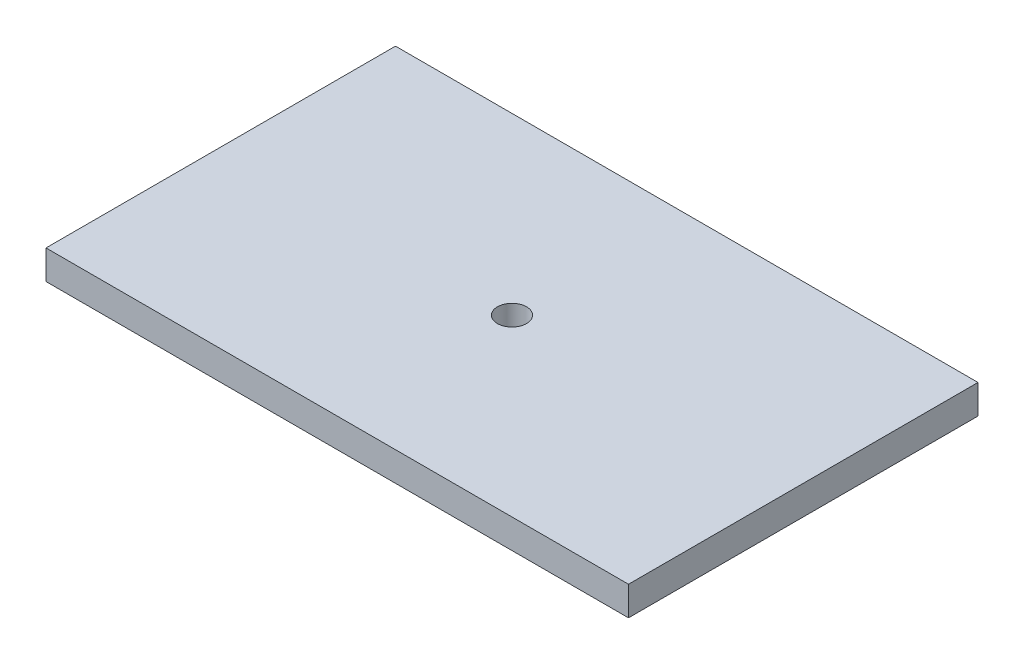
ISO-10303-21;
HEADER;
FILE_DESCRIPTION(('STEP AP214'),'2;1');
FILE_NAME('part.step','',(''),(''),'','','');
FILE_SCHEMA(('AUTOMOTIVE_DESIGN { 1 0 10303 214 1 1 1 1 }'));
ENDSEC;
DATA;
#1=APPLICATION_CONTEXT('core data for automotive mechanical design processes');
#2=APPLICATION_PROTOCOL_DEFINITION('international standard','automotive_design',2000,#1);
#3=PRODUCT_CONTEXT('',#1,'mechanical');
#4=PRODUCT('Part','Part','',(#3));
#5=PRODUCT_RELATED_PRODUCT_CATEGORY('part','',(#4));
#6=PRODUCT_DEFINITION_FORMATION('','',#4);
#7=PRODUCT_DEFINITION_CONTEXT('part definition',#1,'design');
#8=PRODUCT_DEFINITION('design','',#6,#7);
#9=PRODUCT_DEFINITION_SHAPE('','',#8);
#10=(LENGTH_UNIT() NAMED_UNIT(*) SI_UNIT(.MILLI.,.METRE.));
#11=(NAMED_UNIT(*) PLANE_ANGLE_UNIT() SI_UNIT($,.RADIAN.));
#12=(NAMED_UNIT(*) SI_UNIT($,.STERADIAN.) SOLID_ANGLE_UNIT());
#13=UNCERTAINTY_MEASURE_WITH_UNIT(LENGTH_MEASURE(1.E-05),#10,'distance_accuracy_value','');
#14=(GEOMETRIC_REPRESENTATION_CONTEXT(3) GLOBAL_UNCERTAINTY_ASSIGNED_CONTEXT((#13)) GLOBAL_UNIT_ASSIGNED_CONTEXT((#10,
#11,#12)) REPRESENTATION_CONTEXT('',''));
#15=CARTESIAN_POINT('',(0.,0.,0.));
#16=DIRECTION('',(0.,0.,1.));
#17=DIRECTION('',(1.,0.,0.));
#18=AXIS2_PLACEMENT_3D('',#15,#16,#17);
#19=CARTESIAN_POINT('',(0.,10.,0.));
#20=DIRECTION('',(0.,-1.,0.));
#21=DIRECTION('',(0.,0.,-1.));
#22=AXIS2_PLACEMENT_3D('',#19,#20,#21);
#23=PLANE('',#22);
#24=DIRECTION('',(0.,0.,1.));
#25=VECTOR('',#24,1.);
#26=CARTESIAN_POINT('',(-100.,10.,-60.));
#27=LINE('',#26,#25);
#28=CARTESIAN_POINT('',(-100.,10.,-60.));
#29=VERTEX_POINT('',#28);
#30=CARTESIAN_POINT('',(-100.,10.,60.));
#31=VERTEX_POINT('',#30);
#32=EDGE_CURVE('E96',#29,#31,#27,.T.);
#33=ORIENTED_EDGE('',*,*,#32,.T.);
#34=DIRECTION('',(1.,0.,0.));
#35=VECTOR('',#34,1.);
#36=CARTESIAN_POINT('',(100.,10.,60.));
#37=LINE('',#36,#35);
#38=CARTESIAN_POINT('',(100.,10.,60.));
#39=VERTEX_POINT('',#38);
#40=EDGE_CURVE('E91',#31,#39,#37,.T.);
#41=ORIENTED_EDGE('',*,*,#40,.T.);
#42=DIRECTION('',(0.,0.,-1.));
#43=VECTOR('',#42,1.);
#44=CARTESIAN_POINT('',(100.,10.,-60.));
#45=LINE('',#44,#43);
#46=CARTESIAN_POINT('',(100.,10.,-60.));
#47=VERTEX_POINT('',#46);
#48=EDGE_CURVE('E94',#39,#47,#45,.T.);
#49=ORIENTED_EDGE('',*,*,#48,.T.);
#50=DIRECTION('',(-1.,0.,0.));
#51=VECTOR('',#50,1.);
#52=CARTESIAN_POINT('',(100.,10.,-60.));
#53=LINE('',#52,#51);
#54=EDGE_CURVE('E61',#47,#29,#53,.T.);
#55=ORIENTED_EDGE('',*,*,#54,.T.);
#56=EDGE_LOOP('',(#33,#41,#49,#55));
#57=FACE_BOUND('',#56,.T.);
#58=CARTESIAN_POINT('',(0.,10.,0.));
#59=DIRECTION('',(0.,1.,0.));
#60=DIRECTION('',(0.,0.,1.));
#61=AXIS2_PLACEMENT_3D('',#58,#59,#60);
#62=CIRCLE('',#61,5.);
#63=CARTESIAN_POINT('',(0.,10.,5.00000000000002));
#64=VERTEX_POINT('',#63);
#65=EDGE_CURVE('E116',#64,#64,#62,.T.);
#66=ORIENTED_EDGE('',*,*,#65,.F.);
#67=EDGE_LOOP('',(#66));
#68=FACE_BOUND('',#67,.T.);
#69=ADVANCED_FACE('F43',(#57,#68),#23,.F.);
#70=CARTESIAN_POINT('',(0.,0.,0.));
#71=DIRECTION('',(0.,-1.,0.));
#72=DIRECTION('',(0.,0.,-1.));
#73=AXIS2_PLACEMENT_3D('',#70,#71,#72);
#74=PLANE('',#73);
#75=DIRECTION('',(0.,0.,1.));
#76=VECTOR('',#75,1.);
#77=CARTESIAN_POINT('',(-100.,0.,-60.));
#78=LINE('',#77,#76);
#79=CARTESIAN_POINT('',(-100.,0.,-60.));
#80=VERTEX_POINT('',#79);
#81=CARTESIAN_POINT('',(-100.,0.,60.));
#82=VERTEX_POINT('',#81);
#83=EDGE_CURVE('E112',#80,#82,#78,.T.);
#84=ORIENTED_EDGE('',*,*,#83,.F.);
#85=DIRECTION('',(-1.,0.,0.));
#86=VECTOR('',#85,1.);
#87=CARTESIAN_POINT('',(100.,0.,-60.));
#88=LINE('',#87,#86);
#89=CARTESIAN_POINT('',(100.,0.,-60.));
#90=VERTEX_POINT('',#89);
#91=EDGE_CURVE('E84',#90,#80,#88,.T.);
#92=ORIENTED_EDGE('',*,*,#91,.F.);
#93=DIRECTION('',(0.,0.,-1.));
#94=VECTOR('',#93,1.);
#95=CARTESIAN_POINT('',(100.,0.,-60.));
#96=LINE('',#95,#94);
#97=CARTESIAN_POINT('',(100.,0.,60.));
#98=VERTEX_POINT('',#97);
#99=EDGE_CURVE('E78',#98,#90,#96,.T.);
#100=ORIENTED_EDGE('',*,*,#99,.F.);
#101=DIRECTION('',(1.,0.,0.));
#102=VECTOR('',#101,1.);
#103=CARTESIAN_POINT('',(100.,0.,60.));
#104=LINE('',#103,#102);
#105=EDGE_CURVE('E101',#82,#98,#104,.T.);
#106=ORIENTED_EDGE('',*,*,#105,.F.);
#107=EDGE_LOOP('',(#84,#92,#100,#106));
#108=FACE_BOUND('',#107,.T.);
#109=CARTESIAN_POINT('',(0.,0.,0.));
#110=DIRECTION('',(0.,1.,0.));
#111=DIRECTION('',(0.,0.,1.));
#112=AXIS2_PLACEMENT_3D('',#109,#110,#111);
#113=CIRCLE('',#112,5.);
#114=CARTESIAN_POINT('',(0.,0.,5.00000000000002));
#115=VERTEX_POINT('',#114);
#116=EDGE_CURVE('E134',#115,#115,#113,.T.);
#117=ORIENTED_EDGE('',*,*,#116,.T.);
#118=EDGE_LOOP('',(#117));
#119=FACE_BOUND('',#118,.T.);
#120=ADVANCED_FACE('F129',(#108,#119),#74,.T.);
#121=CARTESIAN_POINT('',(-100.,10.,-60.));
#122=DIRECTION('',(1.,0.,0.));
#123=DIRECTION('',(0.,0.,-1.));
#124=AXIS2_PLACEMENT_3D('',#121,#122,#123);
#125=PLANE('',#124);
#126=ORIENTED_EDGE('',*,*,#83,.T.);
#127=DIRECTION('',(0.,-1.,0.));
#128=VECTOR('',#127,1.);
#129=CARTESIAN_POINT('',(-100.,10.,60.));
#130=LINE('',#129,#128);
#131=EDGE_CURVE('E11',#31,#82,#130,.T.);
#132=ORIENTED_EDGE('',*,*,#131,.F.);
#133=ORIENTED_EDGE('',*,*,#32,.F.);
#134=DIRECTION('',(0.,-1.,0.));
#135=VECTOR('',#134,1.);
#136=CARTESIAN_POINT('',(-100.,10.,-60.));
#137=LINE('',#136,#135);
#138=EDGE_CURVE('E108',#29,#80,#137,.T.);
#139=ORIENTED_EDGE('',*,*,#138,.T.);
#140=EDGE_LOOP('',(#126,#132,#133,#139));
#141=FACE_BOUND('',#140,.T.);
#142=ADVANCED_FACE('F45',(#141),#125,.F.);
#143=CARTESIAN_POINT('',(100.,10.,60.));
#144=DIRECTION('',(0.,0.,-1.));
#145=DIRECTION('',(-1.,0.,0.));
#146=AXIS2_PLACEMENT_3D('',#143,#144,#145);
#147=PLANE('',#146);
#148=ORIENTED_EDGE('',*,*,#105,.T.);
#149=DIRECTION('',(0.,-1.,0.));
#150=VECTOR('',#149,1.);
#151=CARTESIAN_POINT('',(100.,10.,60.));
#152=LINE('',#151,#150);
#153=EDGE_CURVE('E53',#39,#98,#152,.T.);
#154=ORIENTED_EDGE('',*,*,#153,.F.);
#155=ORIENTED_EDGE('',*,*,#40,.F.);
#156=ORIENTED_EDGE('',*,*,#131,.T.);
#157=EDGE_LOOP('',(#148,#154,#155,#156));
#158=FACE_BOUND('',#157,.T.);
#159=ADVANCED_FACE('F100',(#158),#147,.F.);
#160=CARTESIAN_POINT('',(100.,10.,-60.));
#161=DIRECTION('',(-1.,0.,0.));
#162=DIRECTION('',(0.,0.,1.));
#163=AXIS2_PLACEMENT_3D('',#160,#161,#162);
#164=PLANE('',#163);
#165=ORIENTED_EDGE('',*,*,#99,.T.);
#166=DIRECTION('',(0.,-1.,0.));
#167=VECTOR('',#166,1.);
#168=CARTESIAN_POINT('',(100.,10.,-60.));
#169=LINE('',#168,#167);
#170=EDGE_CURVE('E103',#47,#90,#169,.T.);
#171=ORIENTED_EDGE('',*,*,#170,.F.);
#172=ORIENTED_EDGE('',*,*,#48,.F.);
#173=ORIENTED_EDGE('',*,*,#153,.T.);
#174=EDGE_LOOP('',(#165,#171,#172,#173));
#175=FACE_BOUND('',#174,.T.);
#176=ADVANCED_FACE('F104',(#175),#164,.F.);
#177=CARTESIAN_POINT('',(100.,10.,-60.));
#178=DIRECTION('',(0.,0.,1.));
#179=DIRECTION('',(1.,0.,0.));
#180=AXIS2_PLACEMENT_3D('',#177,#178,#179);
#181=PLANE('',#180);
#182=ORIENTED_EDGE('',*,*,#91,.T.);
#183=ORIENTED_EDGE('',*,*,#138,.F.);
#184=ORIENTED_EDGE('',*,*,#54,.F.);
#185=ORIENTED_EDGE('',*,*,#170,.T.);
#186=EDGE_LOOP('',(#182,#183,#184,#185));
#187=FACE_BOUND('',#186,.T.);
#188=ADVANCED_FACE('F126',(#187),#181,.F.);
#189=CARTESIAN_POINT('',(0.,10.,0.));
#190=DIRECTION('',(0.,-1.,0.));
#191=DIRECTION('',(0.,0.,-1.));
#192=AXIS2_PLACEMENT_3D('',#189,#190,#191);
#193=CYLINDRICAL_SURFACE('',#192,5.);
#194=ORIENTED_EDGE('',*,*,#65,.T.);
#195=EDGE_LOOP('',(#194));
#196=FACE_BOUND('',#195,.T.);
#197=ORIENTED_EDGE('',*,*,#116,.F.);
#198=EDGE_LOOP('',(#197));
#199=FACE_BOUND('',#198,.T.);
#200=ADVANCED_FACE('F142',(#196,#199),#193,.F.);
#201=CLOSED_SHELL('',(#69,#120,#142,#159,#176,#188,#200));
#202=MANIFOLD_SOLID_BREP('B2',#201);
#203=ADVANCED_BREP_SHAPE_REPRESENTATION('',(#18,#202),#14);
#204=SHAPE_DEFINITION_REPRESENTATION(#9,#203);
ENDSEC;
END-ISO-10303-21;
